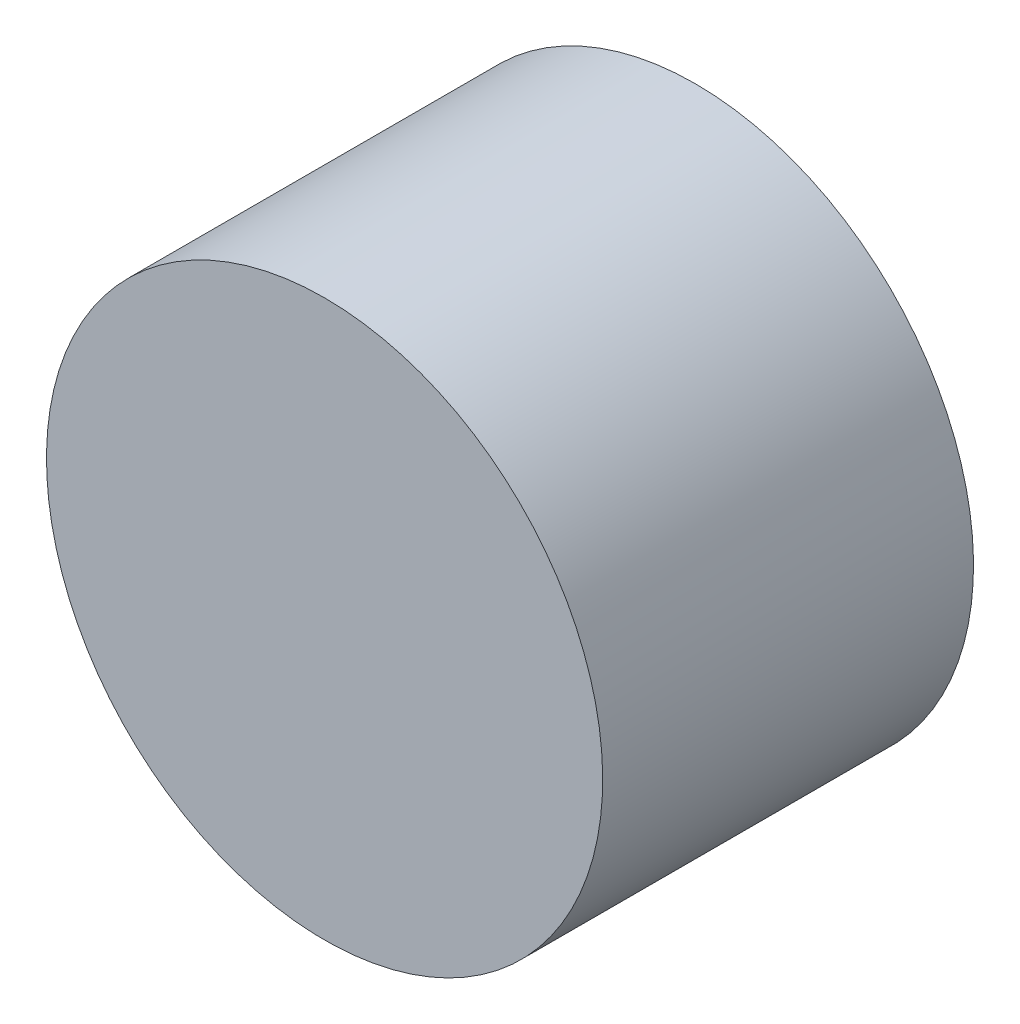
ISO-10303-21;
HEADER;
FILE_DESCRIPTION(('STEP AP214'),'2;1');
FILE_NAME('part.step','',(''),(''),'','','');
FILE_SCHEMA(('AUTOMOTIVE_DESIGN { 1 0 10303 214 1 1 1 1 }'));
ENDSEC;
DATA;
#1=APPLICATION_CONTEXT('core data for automotive mechanical design processes');
#2=APPLICATION_PROTOCOL_DEFINITION('international standard','automotive_design',2000,#1);
#3=PRODUCT_CONTEXT('',#1,'mechanical');
#4=PRODUCT('Part','Part','',(#3));
#5=PRODUCT_RELATED_PRODUCT_CATEGORY('part','',(#4));
#6=PRODUCT_DEFINITION_FORMATION('','',#4);
#7=PRODUCT_DEFINITION_CONTEXT('part definition',#1,'design');
#8=PRODUCT_DEFINITION('design','',#6,#7);
#9=PRODUCT_DEFINITION_SHAPE('','',#8);
#10=(LENGTH_UNIT() NAMED_UNIT(*) SI_UNIT(.MILLI.,.METRE.));
#11=(NAMED_UNIT(*) PLANE_ANGLE_UNIT() SI_UNIT($,.RADIAN.));
#12=(NAMED_UNIT(*) SI_UNIT($,.STERADIAN.) SOLID_ANGLE_UNIT());
#13=UNCERTAINTY_MEASURE_WITH_UNIT(LENGTH_MEASURE(1.E-05),#10,'distance_accuracy_value','');
#14=(GEOMETRIC_REPRESENTATION_CONTEXT(3) GLOBAL_UNCERTAINTY_ASSIGNED_CONTEXT((#13)) GLOBAL_UNIT_ASSIGNED_CONTEXT((#10,
#11,#12)) REPRESENTATION_CONTEXT('',''));
#15=CARTESIAN_POINT('',(0.,0.,0.));
#16=DIRECTION('',(0.,0.,1.));
#17=DIRECTION('',(1.,0.,0.));
#18=AXIS2_PLACEMENT_3D('',#15,#16,#17);
#19=CARTESIAN_POINT('',(0.,0.,38.));
#20=DIRECTION('',(0.,0.,1.));
#21=DIRECTION('',(0.,-1.,0.));
#22=AXIS2_PLACEMENT_3D('',#19,#20,#21);
#23=PLANE('',#22);
#24=CARTESIAN_POINT('',(0.,0.,38.));
#25=DIRECTION('',(0.,0.,-1.));
#26=DIRECTION('',(0.,1.,0.));
#27=AXIS2_PLACEMENT_3D('',#24,#25,#26);
#28=CIRCLE('',#27,28.5);
#29=CARTESIAN_POINT('',(0.,28.5,38.));
#30=VERTEX_POINT('',#29);
#31=EDGE_CURVE('E10',#30,#30,#28,.T.);
#32=ORIENTED_EDGE('',*,*,#31,.F.);
#33=EDGE_LOOP('',(#32));
#34=FACE_BOUND('',#33,.T.);
#35=ADVANCED_FACE('F31',(#34),#23,.T.);
#36=CARTESIAN_POINT('',(0.,0.,20.));
#37=DIRECTION('',(0.,0.,-1.));
#38=DIRECTION('',(0.,1.,0.));
#39=AXIS2_PLACEMENT_3D('',#36,#37,#38);
#40=CYLINDRICAL_SURFACE('',#39,28.5);
#41=ORIENTED_EDGE('',*,*,#31,.T.);
#42=EDGE_LOOP('',(#41));
#43=FACE_BOUND('',#42,.T.);
#44=CARTESIAN_POINT('',(0.,0.,0.));
#45=DIRECTION('',(0.,0.,-1.));
#46=DIRECTION('',(0.,1.,0.));
#47=AXIS2_PLACEMENT_3D('',#44,#45,#46);
#48=CIRCLE('',#47,28.5);
#49=CARTESIAN_POINT('',(0.,28.5,0.));
#50=VERTEX_POINT('',#49);
#51=EDGE_CURVE('E37',#50,#50,#48,.T.);
#52=ORIENTED_EDGE('',*,*,#51,.F.);
#53=EDGE_LOOP('',(#52));
#54=FACE_BOUND('',#53,.T.);
#55=ADVANCED_FACE('F63',(#43,#54),#40,.T.);
#56=CARTESIAN_POINT('',(0.,28.5,0.));
#57=DIRECTION('',(0.,0.,-1.));
#58=DIRECTION('',(0.,1.,0.));
#59=AXIS2_PLACEMENT_3D('',#56,#57,#58);
#60=PLANE('',#59);
#61=ORIENTED_EDGE('',*,*,#51,.T.);
#62=EDGE_LOOP('',(#61));
#63=FACE_BOUND('',#62,.T.);
#64=CARTESIAN_POINT('',(0.,0.,0.));
#65=DIRECTION('',(0.,0.,-1.));
#66=DIRECTION('',(0.,1.,0.));
#67=AXIS2_PLACEMENT_3D('',#64,#65,#66);
#68=CIRCLE('',#67,8.);
#69=CARTESIAN_POINT('',(0.,8.,0.));
#70=VERTEX_POINT('',#69);
#71=EDGE_CURVE('E41',#70,#70,#68,.T.);
#72=ORIENTED_EDGE('',*,*,#71,.F.);
#73=EDGE_LOOP('',(#72));
#74=FACE_BOUND('',#73,.T.);
#75=ADVANCED_FACE('F55',(#63,#74),#60,.T.);
#76=CARTESIAN_POINT('',(0.,0.,20.));
#77=DIRECTION('',(0.,0.,-1.));
#78=DIRECTION('',(0.,1.,0.));
#79=AXIS2_PLACEMENT_3D('',#76,#77,#78);
#80=CYLINDRICAL_SURFACE('',#79,8.);
#81=ORIENTED_EDGE('',*,*,#71,.T.);
#82=EDGE_LOOP('',(#81));
#83=FACE_BOUND('',#82,.T.);
#84=CARTESIAN_POINT('',(0.,0.,20.));
#85=DIRECTION('',(0.,0.,-1.));
#86=DIRECTION('',(0.,1.,0.));
#87=AXIS2_PLACEMENT_3D('',#84,#85,#86);
#88=CIRCLE('',#87,8.);
#89=CARTESIAN_POINT('',(0.,8.,20.));
#90=VERTEX_POINT('',#89);
#91=EDGE_CURVE('E45',#90,#90,#88,.T.);
#92=ORIENTED_EDGE('',*,*,#91,.F.);
#93=EDGE_LOOP('',(#92));
#94=FACE_BOUND('',#93,.T.);
#95=ADVANCED_FACE('F53',(#83,#94),#80,.F.);
#96=CARTESIAN_POINT('',(0.,8.,20.));
#97=DIRECTION('',(0.,0.,-1.));
#98=DIRECTION('',(0.,1.,0.));
#99=AXIS2_PLACEMENT_3D('',#96,#97,#98);
#100=PLANE('',#99);
#101=ORIENTED_EDGE('',*,*,#91,.T.);
#102=EDGE_LOOP('',(#101));
#103=FACE_BOUND('',#102,.T.);
#104=ADVANCED_FACE('F51',(#103),#100,.T.);
#105=CLOSED_SHELL('',(#35,#55,#75,#95,#104));
#106=MANIFOLD_SOLID_BREP('B2',#105);
#107=ADVANCED_BREP_SHAPE_REPRESENTATION('',(#18,#106),#14);
#108=SHAPE_DEFINITION_REPRESENTATION(#9,#107);
ENDSEC;
END-ISO-10303-21;
